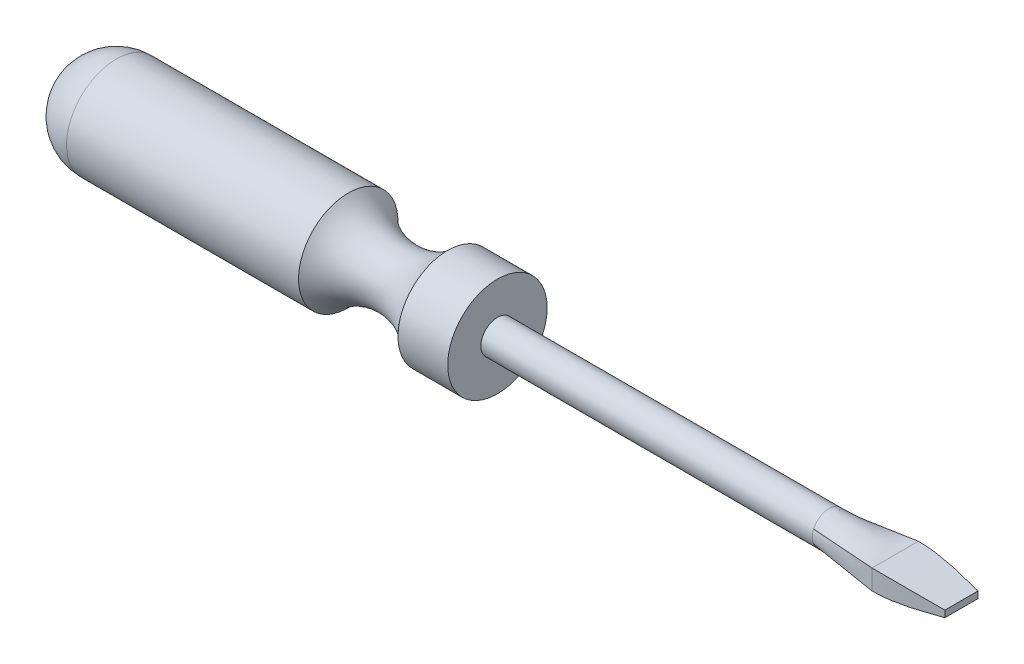
ISO-10303-21;
HEADER;
FILE_DESCRIPTION(('STEP AP214'),'2;1');
FILE_NAME('part.step','',(''),(''),'','','');
FILE_SCHEMA(('AUTOMOTIVE_DESIGN { 1 0 10303 214 1 1 1 1 }'));
ENDSEC;
DATA;
#1=APPLICATION_CONTEXT('core data for automotive mechanical design processes');
#2=APPLICATION_PROTOCOL_DEFINITION('international standard','automotive_design',2000,#1);
#3=PRODUCT_CONTEXT('',#1,'mechanical');
#4=PRODUCT('Part','Part','',(#3));
#5=PRODUCT_RELATED_PRODUCT_CATEGORY('part','',(#4));
#6=PRODUCT_DEFINITION_FORMATION('','',#4);
#7=PRODUCT_DEFINITION_CONTEXT('part definition',#1,'design');
#8=PRODUCT_DEFINITION('design','',#6,#7);
#9=PRODUCT_DEFINITION_SHAPE('','',#8);
#10=(LENGTH_UNIT() NAMED_UNIT(*) SI_UNIT(.MILLI.,.METRE.));
#11=(NAMED_UNIT(*) PLANE_ANGLE_UNIT() SI_UNIT($,.RADIAN.));
#12=(NAMED_UNIT(*) SI_UNIT($,.STERADIAN.) SOLID_ANGLE_UNIT());
#13=UNCERTAINTY_MEASURE_WITH_UNIT(LENGTH_MEASURE(1.E-05),#10,'distance_accuracy_value','');
#14=(GEOMETRIC_REPRESENTATION_CONTEXT(3) GLOBAL_UNCERTAINTY_ASSIGNED_CONTEXT((#13)) GLOBAL_UNIT_ASSIGNED_CONTEXT((#10,
#11,#12)) REPRESENTATION_CONTEXT('',''));
#15=CARTESIAN_POINT('',(0.,0.,0.));
#16=DIRECTION('',(0.,0.,1.));
#17=DIRECTION('',(1.,0.,0.));
#18=AXIS2_PLACEMENT_3D('',#15,#16,#17);
#19=CARTESIAN_POINT('',(-38.1,0.,0.));
#20=DIRECTION('',(1.,0.,0.));
#21=DIRECTION('',(0.,0.,-1.));
#22=AXIS2_PLACEMENT_3D('',#19,#20,#21);
#23=TOROIDAL_SURFACE('',#22,35.8505208252602,25.4);
#24=CARTESIAN_POINT('',(-19.05,0.,0.));
#25=DIRECTION('',(1.,0.,0.));
#26=DIRECTION('',(0.,0.,-1.));
#27=AXIS2_PLACEMENT_3D('',#24,#25,#26);
#28=CIRCLE('',#27,19.05);
#29=CARTESIAN_POINT('',(-19.05,0.,-19.05));
#30=VERTEX_POINT('',#29);
#31=EDGE_CURVE('E303',#30,#30,#28,.T.);
#32=ORIENTED_EDGE('',*,*,#31,.F.);
#33=EDGE_LOOP('',(#32));
#34=FACE_BOUND('',#33,.T.);
#35=CARTESIAN_POINT('',(-57.15,0.,0.));
#36=DIRECTION('',(1.,0.,0.));
#37=DIRECTION('',(0.,0.,-1.));
#38=AXIS2_PLACEMENT_3D('',#35,#36,#37);
#39=CIRCLE('',#38,19.05);
#40=CARTESIAN_POINT('',(-57.15,0.,-19.05));
#41=VERTEX_POINT('',#40);
#42=EDGE_CURVE('E114',#41,#41,#39,.T.);
#43=ORIENTED_EDGE('',*,*,#42,.T.);
#44=EDGE_LOOP('',(#43));
#45=FACE_BOUND('',#44,.T.);
#46=ADVANCED_FACE('F105',(#34,#45),#23,.F.);
#47=CARTESIAN_POINT('',(0.,0.,0.));
#48=DIRECTION('',(1.,0.,0.));
#49=DIRECTION('',(0.,0.,-1.));
#50=AXIS2_PLACEMENT_3D('',#47,#48,#49);
#51=CYLINDRICAL_SURFACE('',#50,19.05);
#52=ORIENTED_EDGE('',*,*,#42,.F.);
#53=EDGE_LOOP('',(#52));
#54=FACE_BOUND('',#53,.T.);
#55=CARTESIAN_POINT('',(-146.05,0.,0.));
#56=DIRECTION('',(1.,0.,0.));
#57=DIRECTION('',(0.,0.,-1.));
#58=AXIS2_PLACEMENT_3D('',#55,#56,#57);
#59=CIRCLE('',#58,19.05);
#60=CARTESIAN_POINT('',(-146.05,0.,-19.05));
#61=VERTEX_POINT('',#60);
#62=EDGE_CURVE('E299',#61,#61,#59,.T.);
#63=ORIENTED_EDGE('',*,*,#62,.T.);
#64=EDGE_LOOP('',(#63));
#65=FACE_BOUND('',#64,.T.);
#66=ADVANCED_FACE('F286',(#54,#65),#51,.T.);
#67=CARTESIAN_POINT('',(-146.05,0.,0.));
#68=DIRECTION('',(1.,0.,0.));
#69=DIRECTION('',(0.,-1.,0.));
#70=AXIS2_PLACEMENT_3D('',#67,#68,#69);
#71=SPHERICAL_SURFACE('',#70,19.05);
#72=ORIENTED_EDGE('',*,*,#62,.F.);
#73=EDGE_LOOP('',(#72));
#74=FACE_BOUND('',#73,.T.);
#75=ADVANCED_FACE('F283',(#74),#71,.T.);
#76=CARTESIAN_POINT('',(0.,0.,0.));
#77=DIRECTION('',(-1.,0.,0.));
#78=DIRECTION('',(0.,0.,1.));
#79=AXIS2_PLACEMENT_3D('',#76,#77,#78);
#80=PLANE('',#79);
#81=CARTESIAN_POINT('',(0.,0.,0.));
#82=DIRECTION('',(1.,0.,0.));
#83=DIRECTION('',(0.,0.,-1.));
#84=AXIS2_PLACEMENT_3D('',#81,#82,#83);
#85=CIRCLE('',#84,6.35);
#86=CARTESIAN_POINT('',(0.,0.,-6.35));
#87=VERTEX_POINT('',#86);
#88=EDGE_CURVE('E12',#87,#87,#85,.T.);
#89=ORIENTED_EDGE('',*,*,#88,.F.);
#90=EDGE_LOOP('',(#89));
#91=FACE_BOUND('',#90,.T.);
#92=CARTESIAN_POINT('',(0.,0.,0.));
#93=DIRECTION('',(1.,0.,0.));
#94=DIRECTION('',(0.,0.,-1.));
#95=AXIS2_PLACEMENT_3D('',#92,#93,#94);
#96=CIRCLE('',#95,19.05);
#97=CARTESIAN_POINT('',(0.,0.,-19.05));
#98=VERTEX_POINT('',#97);
#99=EDGE_CURVE('E300',#98,#98,#96,.T.);
#100=ORIENTED_EDGE('',*,*,#99,.T.);
#101=EDGE_LOOP('',(#100));
#102=FACE_BOUND('',#101,.T.);
#103=ADVANCED_FACE('F279',(#91,#102),#80,.F.);
#104=CARTESIAN_POINT('',(0.,0.,0.));
#105=DIRECTION('',(1.,0.,0.));
#106=DIRECTION('',(0.,0.,-1.));
#107=AXIS2_PLACEMENT_3D('',#104,#105,#106);
#108=CYLINDRICAL_SURFACE('',#107,19.05);
#109=ORIENTED_EDGE('',*,*,#99,.F.);
#110=EDGE_LOOP('',(#109));
#111=FACE_BOUND('',#110,.T.);
#112=ORIENTED_EDGE('',*,*,#31,.T.);
#113=EDGE_LOOP('',(#112));
#114=FACE_BOUND('',#113,.T.);
#115=ADVANCED_FACE('F272',(#111,#114),#108,.T.);
#116=CARTESIAN_POINT('',(127.,0.,0.));
#117=DIRECTION('',(-1.,0.,0.));
#118=DIRECTION('',(0.,0.,1.));
#119=AXIS2_PLACEMENT_3D('',#116,#117,#118);
#120=CYLINDRICAL_SURFACE('',#119,6.35);
#121=CARTESIAN_POINT('',(127.,2.50138754597771,-5.83657094061467));
#122=CARTESIAN_POINT('',(127.,2.94844214367886,-5.64497611302846));
#123=CARTESIAN_POINT('',(127.,3.40865301090924,-5.38683517407006));
#124=CARTESIAN_POINT('',(127.,4.29988982111754,-4.70615087599503));
#125=CARTESIAN_POINT('',(127.,4.73049101540995,-4.28265686149858));
#126=CARTESIAN_POINT('',(127.,5.47920605203683,-3.27062625188786));
#127=CARTESIAN_POINT('',(127.,5.79593543981634,-2.68164394034329));
#128=CARTESIAN_POINT('',(127.,6.232075766083,-1.39474495557426));
#129=CARTESIAN_POINT('',(127.,6.35,-0.697860933862758));
#130=CARTESIAN_POINT('',(127.,6.35,0.697860933862757));
#131=CARTESIAN_POINT('',(127.,6.232075766083,1.39474495557426));
#132=CARTESIAN_POINT('',(127.,5.79593543981634,2.68164394034329));
#133=CARTESIAN_POINT('',(127.,5.47920605203683,3.27062625188786));
#134=CARTESIAN_POINT('',(127.,4.73049101540995,4.28265686149858));
#135=CARTESIAN_POINT('',(127.,4.29988982111754,4.70615087599503));
#136=CARTESIAN_POINT('',(127.,3.40865301090924,5.38683517407006));
#137=CARTESIAN_POINT('',(127.,2.94844214367886,5.64497611302846));
#138=CARTESIAN_POINT('',(127.,2.50138754597771,5.83657094061467));
#139=B_SPLINE_CURVE_WITH_KNOTS('',3,(#121,#122,#123,#124,#125,#126,#127,#128,#129,#130,#131,
#132,#133,#134,#135,#136,#137,#138),.UNSPECIFIED.,.F.,.F.,(4,2,2,2,2,2,2,2,4),(0.,0.125,0.25,
0.375,0.5,0.625,0.75,0.875,1.),.UNSPECIFIED.);
#140=CARTESIAN_POINT('',(127.,2.50139250402741,-5.83658255969297));
#141=VERTEX_POINT('',#140);
#142=CARTESIAN_POINT('',(127.,2.50138922971672,5.83657488013594));
#143=VERTEX_POINT('',#142);
#144=EDGE_CURVE('E307',#141,#143,#139,.T.);
#145=ORIENTED_EDGE('',*,*,#144,.F.);
#146=CARTESIAN_POINT('',(127.,0.,0.));
#147=DIRECTION('',(1.,0.,0.));
#148=DIRECTION('',(0.,0.,-1.));
#149=AXIS2_PLACEMENT_3D('',#146,#147,#148);
#150=CIRCLE('',#149,6.35);
#151=CARTESIAN_POINT('',(127.,-2.50138922971672,-5.83657488013592));
#152=VERTEX_POINT('',#151);
#153=EDGE_CURVE('E122',#152,#141,#150,.T.);
#154=ORIENTED_EDGE('',*,*,#153,.F.);
#155=CARTESIAN_POINT('',(127.,-2.50139250402742,5.83658255969299));
#156=VERTEX_POINT('',#155);
#157=EDGE_CURVE('E128',#156,#152,#150,.T.);
#158=ORIENTED_EDGE('',*,*,#157,.F.);
#159=EDGE_CURVE('E173',#143,#156,#150,.T.);
#160=ORIENTED_EDGE('',*,*,#159,.F.);
#161=EDGE_LOOP('',(#145,#154,#158,#160));
#162=FACE_BOUND('',#161,.T.);
#163=ORIENTED_EDGE('',*,*,#88,.T.);
#164=EDGE_LOOP('',(#163));
#165=FACE_BOUND('',#164,.T.);
#166=ADVANCED_FACE('F261',(#162,#165),#120,.T.);
#167=CARTESIAN_POINT('',(127.,2.50138754597771,-5.83657094061467));
#168=CARTESIAN_POINT('',(152.4,3.81,-8.89));
#169=CARTESIAN_POINT('',(127.,2.94844214367886,-5.64497611302846));
#170=CARTESIAN_POINT('',(152.4,3.81,-8.14916666666666));
#171=CARTESIAN_POINT('',(127.,3.40865301090924,-5.38683517407006));
#172=CARTESIAN_POINT('',(152.4,3.81,-7.40833333333333));
#173=CARTESIAN_POINT('',(127.,4.29988982111754,-4.70615087599503));
#174=CARTESIAN_POINT('',(152.4,3.81,-5.92666666666666));
#175=CARTESIAN_POINT('',(127.,4.73049101540995,-4.28265686149858));
#176=CARTESIAN_POINT('',(152.4,3.81,-5.18583333333333));
#177=CARTESIAN_POINT('',(127.,5.47920605203683,-3.27062625188786));
#178=CARTESIAN_POINT('',(152.4,3.81,-3.70416666666667));
#179=CARTESIAN_POINT('',(127.,5.79593543981634,-2.68164394034329));
#180=CARTESIAN_POINT('',(152.4,3.81,-2.96333333333333));
#181=CARTESIAN_POINT('',(127.,6.232075766083,-1.39474495557426));
#182=CARTESIAN_POINT('',(152.4,3.81,-1.48166666666667));
#183=CARTESIAN_POINT('',(127.,6.35,-0.697860933862758));
#184=CARTESIAN_POINT('',(152.4,3.81,-0.740833333333334));
#185=CARTESIAN_POINT('',(127.,6.35,0.697860933862757));
#186=CARTESIAN_POINT('',(152.4,3.81,0.740833333333333));
#187=CARTESIAN_POINT('',(127.,6.232075766083,1.39474495557426));
#188=CARTESIAN_POINT('',(152.4,3.81,1.48166666666667));
#189=CARTESIAN_POINT('',(127.,5.79593543981634,2.68164394034329));
#190=CARTESIAN_POINT('',(152.4,3.81,2.96333333333333));
#191=CARTESIAN_POINT('',(127.,5.47920605203683,3.27062625188786));
#192=CARTESIAN_POINT('',(152.4,3.81,3.70416666666667));
#193=CARTESIAN_POINT('',(127.,4.73049101540995,4.28265686149858));
#194=CARTESIAN_POINT('',(152.4,3.81,5.18583333333333));
#195=CARTESIAN_POINT('',(127.,4.29988982111754,4.70615087599503));
#196=CARTESIAN_POINT('',(152.4,3.81,5.92666666666667));
#197=CARTESIAN_POINT('',(127.,3.40865301090924,5.38683517407006));
#198=CARTESIAN_POINT('',(152.4,3.81,7.40833333333333));
#199=CARTESIAN_POINT('',(127.,2.94844214367886,5.64497611302846));
#200=CARTESIAN_POINT('',(152.4,3.81,8.14916666666667));
#201=CARTESIAN_POINT('',(127.,2.50138754597771,5.83657094061467));
#202=CARTESIAN_POINT('',(152.4,3.81,8.89));
#203=B_SPLINE_SURFACE_WITH_KNOTS('',3,1,((#167,#168),(#169,#170),(#171,#172),(#173,#174),(#175,
#176),(#177,#178),(#179,#180),(#181,#182),(#183,#184),(#185,#186),(#187,#188),(#189,#190),(#191,
#192),(#193,#194),(#195,#196),(#197,#198),(#199,#200),(#201,#202)),.UNSPECIFIED.,.F.,.F.,.F.,(4,
2,2,2,2,2,2,2,4),(2,2),(0.,0.125,0.25,0.375,0.5,0.625,0.75,0.875,1.),(0.,1.),.UNSPECIFIED.);
#204=DIRECTION('',(0.991555349267936,0.0510851054686787,0.119198579426917));
#205=VECTOR('',#204,1.);
#206=CARTESIAN_POINT('',(139.7,3.15569377298886,7.36328547030733));
#207=LINE('',#206,#205);
#208=CARTESIAN_POINT('',(152.4,3.81,8.89));
#209=VERTEX_POINT('',#208);
#210=EDGE_CURVE('E409',#143,#209,#207,.T.);
#211=DIRECTION('',(0.,0.,1.));
#212=VECTOR('',#211,1.);
#213=CARTESIAN_POINT('',(152.4,3.81,8.89));
#214=LINE('',#213,#212);
#215=CARTESIAN_POINT('',(152.4,3.81,-8.89));
#216=VERTEX_POINT('',#215);
#217=EDGE_CURVE('E315',#216,#209,#214,.T.);
#218=DIRECTION('',(-0.991555349267936,-0.0510851054686787,0.119198579426917));
#219=VECTOR('',#218,1.);
#220=CARTESIAN_POINT('',(139.7,3.15569377298886,-7.36328547030733));
#221=LINE('',#220,#219);
#222=EDGE_CURVE('E410',#216,#141,#221,.T.);
#223=ORIENTED_EDGE('',*,*,#144,.T.);
#224=ORIENTED_EDGE('',*,*,#210,.T.);
#225=ORIENTED_EDGE('',*,*,#217,.F.);
#226=ORIENTED_EDGE('',*,*,#222,.T.);
#227=EDGE_LOOP('',(#223,#224,#225,#226));
#228=FACE_BOUND('',#227,.T.);
#229=ADVANCED_FACE('F271',(#228),#203,.T.);
#230=CARTESIAN_POINT('',(127.,2.50138754597772,5.83657094061467));
#231=CARTESIAN_POINT('',(152.4,3.81,8.89));
#232=CARTESIAN_POINT('',(127.,2.1181978908053,6.0007950785457));
#233=CARTESIAN_POINT('',(152.4,3.175,8.89));
#234=CARTESIAN_POINT('',(127.,1.710772808108,6.1303017425397));
#235=CARTESIAN_POINT('',(152.4,2.54,8.89));
#236=CARTESIAN_POINT('',(127.,0.868829874417571,6.30495659817469));
#237=CARTESIAN_POINT('',(152.4,1.27,8.89));
#238=CARTESIAN_POINT('',(127.,0.434462135803981,6.35));
#239=CARTESIAN_POINT('',(152.4,0.634999999999999,8.89));
#240=CARTESIAN_POINT('',(127.,-0.434462135803979,6.35));
#241=CARTESIAN_POINT('',(152.4,-0.635000000000001,8.89));
#242=CARTESIAN_POINT('',(127.,-0.868829874417569,6.30495659817469));
#243=CARTESIAN_POINT('',(152.4,-1.27,8.89));
#244=CARTESIAN_POINT('',(127.,-1.710772808108,6.1303017425397));
#245=CARTESIAN_POINT('',(152.4,-2.54,8.89));
#246=CARTESIAN_POINT('',(127.,-2.1181978908053,6.0007950785457));
#247=CARTESIAN_POINT('',(152.4,-3.175,8.89));
#248=CARTESIAN_POINT('',(127.,-2.50138754597771,5.83657094061467));
#249=CARTESIAN_POINT('',(152.4,-3.81,8.89));
#250=B_SPLINE_SURFACE_WITH_KNOTS('',3,1,((#230,#231),(#232,#233),(#234,#235),(#236,#237),(#238,
#239),(#240,#241),(#242,#243),(#244,#245),(#246,#247),(#248,#249)),.UNSPECIFIED.,.F.,.F.,.F.,(4,
2,2,2,4),(2,2),(0.,0.25,0.5,0.75,1.),(0.,1.),.UNSPECIFIED.);
#251=DIRECTION('',(0.991555349267936,-0.0510851054686787,0.119198579426917));
#252=VECTOR('',#251,1.);
#253=CARTESIAN_POINT('',(139.7,-3.15569377298886,7.36328547030733));
#254=LINE('',#253,#252);
#255=CARTESIAN_POINT('',(152.4,-3.81,8.89));
#256=VERTEX_POINT('',#255);
#257=EDGE_CURVE('E411',#156,#256,#254,.T.);
#258=DIRECTION('',(0.,-1.,0.));
#259=VECTOR('',#258,1.);
#260=CARTESIAN_POINT('',(152.4,3.81,8.89));
#261=LINE('',#260,#259);
#262=EDGE_CURVE('E169',#209,#256,#261,.T.);
#263=ORIENTED_EDGE('',*,*,#159,.T.);
#264=ORIENTED_EDGE('',*,*,#257,.T.);
#265=ORIENTED_EDGE('',*,*,#262,.F.);
#266=ORIENTED_EDGE('',*,*,#210,.F.);
#267=EDGE_LOOP('',(#263,#264,#265,#266));
#268=FACE_BOUND('',#267,.T.);
#269=ADVANCED_FACE('F326',(#268),#250,.T.);
#270=CARTESIAN_POINT('',(127.,-2.50138754597772,-5.83657094061467));
#271=CARTESIAN_POINT('',(152.4,-3.81,-8.89));
#272=CARTESIAN_POINT('',(127.,-2.1181978908053,-6.0007950785457));
#273=CARTESIAN_POINT('',(152.4,-3.175,-8.89));
#274=CARTESIAN_POINT('',(127.,-1.710772808108,-6.1303017425397));
#275=CARTESIAN_POINT('',(152.4,-2.53999999999999,-8.89));
#276=CARTESIAN_POINT('',(127.,-0.868829874417571,-6.30495659817469));
#277=CARTESIAN_POINT('',(152.4,-1.26999999999999,-8.89));
#278=CARTESIAN_POINT('',(127.,-0.434462135803981,-6.35));
#279=CARTESIAN_POINT('',(152.4,-0.634999999999991,-8.89));
#280=CARTESIAN_POINT('',(127.,0.434462135803979,-6.35));
#281=CARTESIAN_POINT('',(152.4,0.635000000000008,-8.89));
#282=CARTESIAN_POINT('',(127.,0.86882987441757,-6.30495659817469));
#283=CARTESIAN_POINT('',(152.4,1.27000000000001,-8.89));
#284=CARTESIAN_POINT('',(127.,1.710772808108,-6.1303017425397));
#285=CARTESIAN_POINT('',(152.4,2.54,-8.89));
#286=CARTESIAN_POINT('',(127.,2.1181978908053,-6.0007950785457));
#287=CARTESIAN_POINT('',(152.4,3.175,-8.89));
#288=CARTESIAN_POINT('',(127.,2.50138754597771,-5.83657094061467));
#289=CARTESIAN_POINT('',(152.4,3.81,-8.89));
#290=B_SPLINE_SURFACE_WITH_KNOTS('',3,1,((#270,#271),(#272,#273),(#274,#275),(#276,#277),(#278,
#279),(#280,#281),(#282,#283),(#284,#285),(#286,#287),(#288,#289)),.UNSPECIFIED.,.F.,.F.,.F.,(4,
2,2,2,4),(2,2),(0.,0.25,0.5,0.75,1.),(0.,1.),.UNSPECIFIED.);
#291=DIRECTION('',(0.,1.,0.));
#292=VECTOR('',#291,1.);
#293=CARTESIAN_POINT('',(152.4,3.81,-8.89));
#294=LINE('',#293,#292);
#295=CARTESIAN_POINT('',(152.4,-3.81,-8.89));
#296=VERTEX_POINT('',#295);
#297=EDGE_CURVE('E108',#296,#216,#294,.T.);
#298=DIRECTION('',(0.991555349267936,-0.0510851054686787,-0.119198579426917));
#299=VECTOR('',#298,1.);
#300=CARTESIAN_POINT('',(139.7,-3.15569377298886,-7.36328547030733));
#301=LINE('',#300,#299);
#302=EDGE_CURVE('E413',#152,#296,#301,.T.);
#303=ORIENTED_EDGE('',*,*,#153,.T.);
#304=ORIENTED_EDGE('',*,*,#222,.F.);
#305=ORIENTED_EDGE('',*,*,#297,.F.);
#306=ORIENTED_EDGE('',*,*,#302,.F.);
#307=EDGE_LOOP('',(#303,#304,#305,#306));
#308=FACE_BOUND('',#307,.T.);
#309=ADVANCED_FACE('F337',(#308),#290,.T.);
#310=CARTESIAN_POINT('',(127.,-2.50138754597771,5.83657094061467));
#311=CARTESIAN_POINT('',(152.4,-3.81,8.89));
#312=CARTESIAN_POINT('',(127.,-2.94844214367886,5.64497611302846));
#313=CARTESIAN_POINT('',(152.4,-3.81,8.14916666666667));
#314=CARTESIAN_POINT('',(127.,-3.40865301090924,5.38683517407006));
#315=CARTESIAN_POINT('',(152.4,-3.81,7.40833333333333));
#316=CARTESIAN_POINT('',(127.,-4.29988982111754,4.70615087599503));
#317=CARTESIAN_POINT('',(152.4,-3.81,5.92666666666666));
#318=CARTESIAN_POINT('',(127.,-4.73049101540995,4.28265686149858));
#319=CARTESIAN_POINT('',(152.4,-3.81,5.18583333333333));
#320=CARTESIAN_POINT('',(127.,-5.47920605203683,3.27062625188786));
#321=CARTESIAN_POINT('',(152.4,-3.81,3.70416666666666));
#322=CARTESIAN_POINT('',(127.,-5.79593543981634,2.68164394034329));
#323=CARTESIAN_POINT('',(152.4,-3.81,2.96333333333333));
#324=CARTESIAN_POINT('',(127.,-6.232075766083,1.39474495557426));
#325=CARTESIAN_POINT('',(152.4,-3.81,1.48166666666666));
#326=CARTESIAN_POINT('',(127.,-6.35,0.697860933862759));
#327=CARTESIAN_POINT('',(152.4,-3.81,0.740833333333331));
#328=CARTESIAN_POINT('',(127.,-6.35,-0.697860933862756));
#329=CARTESIAN_POINT('',(152.4,-3.81,-0.740833333333336));
#330=CARTESIAN_POINT('',(127.,-6.232075766083,-1.39474495557426));
#331=CARTESIAN_POINT('',(152.4,-3.81,-1.48166666666667));
#332=CARTESIAN_POINT('',(127.,-5.79593543981634,-2.68164394034329));
#333=CARTESIAN_POINT('',(152.4,-3.81,-2.96333333333333));
#334=CARTESIAN_POINT('',(127.,-5.47920605203683,-3.27062625188786));
#335=CARTESIAN_POINT('',(152.4,-3.81,-3.70416666666667));
#336=CARTESIAN_POINT('',(127.,-4.73049101540994,-4.28265686149858));
#337=CARTESIAN_POINT('',(152.4,-3.81,-5.18583333333333));
#338=CARTESIAN_POINT('',(127.,-4.29988982111754,-4.70615087599503));
#339=CARTESIAN_POINT('',(152.4,-3.81,-5.92666666666667));
#340=CARTESIAN_POINT('',(127.,-3.40865301090924,-5.38683517407006));
#341=CARTESIAN_POINT('',(152.4,-3.81,-7.40833333333333));
#342=CARTESIAN_POINT('',(127.,-2.94844214367887,-5.64497611302846));
#343=CARTESIAN_POINT('',(152.4,-3.81,-8.14916666666667));
#344=CARTESIAN_POINT('',(127.,-2.50138754597771,-5.83657094061467));
#345=CARTESIAN_POINT('',(152.4,-3.81,-8.89));
#346=B_SPLINE_SURFACE_WITH_KNOTS('',3,1,((#310,#311),(#312,#313),(#314,#315),(#316,#317),(#318,
#319),(#320,#321),(#322,#323),(#324,#325),(#326,#327),(#328,#329),(#330,#331),(#332,#333),(#334,
#335),(#336,#337),(#338,#339),(#340,#341),(#342,#343),(#344,#345)),.UNSPECIFIED.,.F.,.F.,.F.,(4,
2,2,2,2,2,2,2,4),(2,2),(0.,0.125,0.25,0.375,0.5,0.625,0.75,0.875,1.),(0.,1.),.UNSPECIFIED.);
#347=DIRECTION('',(0.,0.,-1.));
#348=VECTOR('',#347,1.);
#349=CARTESIAN_POINT('',(152.4,-3.81,8.89));
#350=LINE('',#349,#348);
#351=EDGE_CURVE('E313',#256,#296,#350,.T.);
#352=ORIENTED_EDGE('',*,*,#157,.T.);
#353=ORIENTED_EDGE('',*,*,#302,.T.);
#354=ORIENTED_EDGE('',*,*,#351,.F.);
#355=ORIENTED_EDGE('',*,*,#257,.F.);
#356=EDGE_LOOP('',(#352,#353,#354,#355));
#357=FACE_BOUND('',#356,.T.);
#358=ADVANCED_FACE('F211',(#357),#346,.T.);
#359=CARTESIAN_POINT('',(177.8,0.,0.));
#360=DIRECTION('',(-1.,0.,0.));
#361=DIRECTION('',(0.,0.,1.));
#362=AXIS2_PLACEMENT_3D('',#359,#360,#361);
#363=PLANE('',#362);
#364=DIRECTION('',(0.,1.,0.));
#365=VECTOR('',#364,1.);
#366=CARTESIAN_POINT('',(177.8,-1.27,-6.35));
#367=LINE('',#366,#365);
#368=CARTESIAN_POINT('',(177.8,-1.27,-6.35));
#369=VERTEX_POINT('',#368);
#370=CARTESIAN_POINT('',(177.8,1.27,-6.35));
#371=VERTEX_POINT('',#370);
#372=EDGE_CURVE('E234',#369,#371,#367,.T.);
#373=ORIENTED_EDGE('',*,*,#372,.T.);
#374=DIRECTION('',(0.,0.,1.));
#375=VECTOR('',#374,1.);
#376=CARTESIAN_POINT('',(177.8,1.27,6.35));
#377=LINE('',#376,#375);
#378=CARTESIAN_POINT('',(177.8,1.27,6.35));
#379=VERTEX_POINT('',#378);
#380=EDGE_CURVE('E191',#371,#379,#377,.T.);
#381=ORIENTED_EDGE('',*,*,#380,.T.);
#382=DIRECTION('',(0.,-1.,0.));
#383=VECTOR('',#382,1.);
#384=CARTESIAN_POINT('',(177.8,-1.27,6.35));
#385=LINE('',#384,#383);
#386=CARTESIAN_POINT('',(177.8,-1.27,6.35));
#387=VERTEX_POINT('',#386);
#388=EDGE_CURVE('E166',#379,#387,#385,.T.);
#389=ORIENTED_EDGE('',*,*,#388,.T.);
#390=DIRECTION('',(0.,0.,-1.));
#391=VECTOR('',#390,1.);
#392=CARTESIAN_POINT('',(177.8,-1.27,6.35));
#393=LINE('',#392,#391);
#394=EDGE_CURVE('E177',#387,#369,#393,.T.);
#395=ORIENTED_EDGE('',*,*,#394,.T.);
#396=EDGE_LOOP('',(#373,#381,#389,#395));
#397=FACE_BOUND('',#396,.T.);
#398=ADVANCED_FACE('F190',(#397),#363,.F.);
#399=CARTESIAN_POINT('',(177.8,1.27,6.35));
#400=CARTESIAN_POINT('',(169.375457090573,2.54,7.62));
#401=CARTESIAN_POINT('',(160.950914181147,3.81,8.89));
#402=CARTESIAN_POINT('',(152.4,3.81,8.89));
#403=CARTESIAN_POINT('',(177.8,1.27,2.11666666666666));
#404=CARTESIAN_POINT('',(169.375457090573,2.54,2.54));
#405=CARTESIAN_POINT('',(160.950914181147,3.81,2.96333333333333));
#406=CARTESIAN_POINT('',(152.4,3.81,2.96333333333333));
#407=CARTESIAN_POINT('',(177.8,1.27,-2.11666666666667));
#408=CARTESIAN_POINT('',(169.375457090573,2.54,-2.54));
#409=CARTESIAN_POINT('',(160.950914181147,3.81,-2.96333333333333));
#410=CARTESIAN_POINT('',(152.4,3.81,-2.96333333333333));
#411=CARTESIAN_POINT('',(177.8,1.27,-6.35));
#412=CARTESIAN_POINT('',(169.375457090573,2.54,-7.62));
#413=CARTESIAN_POINT('',(160.950914181147,3.81,-8.89));
#414=CARTESIAN_POINT('',(152.4,3.81,-8.89));
#415=B_SPLINE_SURFACE_WITH_KNOTS('',3,3,((#399,#400,#401,#402),(#403,#404,#405,#406),(#407,#408,
#409,#410),(#411,#412,#413,#414)),.UNSPECIFIED.,.F.,.F.,.F.,(4,4),(4,4),(0.,1.),(0.,1.),.UNSPECIFIED.);
#416=CARTESIAN_POINT('',(177.8,1.27,-6.35));
#417=CARTESIAN_POINT('',(169.375457090573,2.54,-7.62));
#418=CARTESIAN_POINT('',(160.950914181147,3.81,-8.89));
#419=CARTESIAN_POINT('',(152.4,3.81,-8.89));
#420=B_SPLINE_CURVE_WITH_KNOTS('',3,(#416,#417,#418,#419),.UNSPECIFIED.,.F.,.F.,(4,4),(0.,1.),.UNSPECIFIED.);
#421=EDGE_CURVE('E445',#371,#216,#420,.T.);
#422=CARTESIAN_POINT('',(177.8,1.27,6.35));
#423=CARTESIAN_POINT('',(169.375457090573,2.54,7.62));
#424=CARTESIAN_POINT('',(160.950914181147,3.81,8.89));
#425=CARTESIAN_POINT('',(152.4,3.81,8.89));
#426=B_SPLINE_CURVE_WITH_KNOTS('',3,(#422,#423,#424,#425),.UNSPECIFIED.,.F.,.F.,(4,4),(0.,1.),.UNSPECIFIED.);
#427=EDGE_CURVE('E185',#209,#379,#426,.F.);
#428=ORIENTED_EDGE('',*,*,#380,.F.);
#429=ORIENTED_EDGE('',*,*,#421,.T.);
#430=ORIENTED_EDGE('',*,*,#217,.T.);
#431=ORIENTED_EDGE('',*,*,#427,.T.);
#432=EDGE_LOOP('',(#428,#429,#430,#431));
#433=FACE_BOUND('',#432,.T.);
#434=ADVANCED_FACE('F210',(#433),#415,.T.);
#435=CARTESIAN_POINT('',(177.8,1.27,-6.35));
#436=CARTESIAN_POINT('',(169.375457090573,2.54,-7.62));
#437=CARTESIAN_POINT('',(160.950914181147,3.81,-8.89));
#438=CARTESIAN_POINT('',(152.4,3.81,-8.89));
#439=CARTESIAN_POINT('',(177.8,0.423333333333333,-6.35));
#440=CARTESIAN_POINT('',(169.375457090573,0.846666666666667,-7.62));
#441=CARTESIAN_POINT('',(160.950914181147,1.27,-8.89));
#442=CARTESIAN_POINT('',(152.4,1.27,-8.89));
#443=CARTESIAN_POINT('',(177.8,-0.423333333333334,-6.35));
#444=CARTESIAN_POINT('',(169.375457090573,-0.846666666666666,-7.62));
#445=CARTESIAN_POINT('',(160.950914181147,-1.27,-8.89));
#446=CARTESIAN_POINT('',(152.4,-1.27,-8.89));
#447=CARTESIAN_POINT('',(177.8,-1.27,-6.35));
#448=CARTESIAN_POINT('',(169.375457090573,-2.54,-7.62));
#449=CARTESIAN_POINT('',(160.950914181147,-3.81,-8.89));
#450=CARTESIAN_POINT('',(152.4,-3.81,-8.89));
#451=B_SPLINE_SURFACE_WITH_KNOTS('',3,3,((#435,#436,#437,#438),(#439,#440,#441,#442),(#443,#444,
#445,#446),(#447,#448,#449,#450)),.UNSPECIFIED.,.F.,.F.,.F.,(4,4),(4,4),(0.,1.),(0.,1.),.UNSPECIFIED.);
#452=CARTESIAN_POINT('',(177.8,-1.27,-6.35));
#453=CARTESIAN_POINT('',(169.375457090573,-2.54,-7.62));
#454=CARTESIAN_POINT('',(160.950914181147,-3.81,-8.89));
#455=CARTESIAN_POINT('',(152.4,-3.81,-8.89));
#456=B_SPLINE_CURVE_WITH_KNOTS('',3,(#452,#453,#454,#455),.UNSPECIFIED.,.F.,.F.,(4,4),(0.,1.),.UNSPECIFIED.);
#457=EDGE_CURVE('E174',#369,#296,#456,.T.);
#458=ORIENTED_EDGE('',*,*,#372,.F.);
#459=ORIENTED_EDGE('',*,*,#457,.T.);
#460=ORIENTED_EDGE('',*,*,#297,.T.);
#461=ORIENTED_EDGE('',*,*,#421,.F.);
#462=EDGE_LOOP('',(#458,#459,#460,#461));
#463=FACE_BOUND('',#462,.T.);
#464=ADVANCED_FACE('F444',(#463),#451,.T.);
#465=CARTESIAN_POINT('',(177.8,-1.27,6.35));
#466=CARTESIAN_POINT('',(169.375457090573,-2.54,7.62));
#467=CARTESIAN_POINT('',(160.950914181147,-3.81,8.89));
#468=CARTESIAN_POINT('',(152.4,-3.81,8.89));
#469=CARTESIAN_POINT('',(177.8,-0.423333333333334,6.35));
#470=CARTESIAN_POINT('',(169.375457090573,-0.846666666666667,7.62));
#471=CARTESIAN_POINT('',(160.950914181147,-1.27,8.89));
#472=CARTESIAN_POINT('',(152.4,-1.27,8.89));
#473=CARTESIAN_POINT('',(177.8,0.423333333333333,6.35));
#474=CARTESIAN_POINT('',(169.375457090573,0.846666666666666,7.62));
#475=CARTESIAN_POINT('',(160.950914181147,1.27,8.89));
#476=CARTESIAN_POINT('',(152.4,1.27,8.89));
#477=CARTESIAN_POINT('',(177.8,1.27,6.35));
#478=CARTESIAN_POINT('',(169.375457090573,2.54,7.62));
#479=CARTESIAN_POINT('',(160.950914181147,3.81,8.89));
#480=CARTESIAN_POINT('',(152.4,3.81,8.89));
#481=B_SPLINE_SURFACE_WITH_KNOTS('',3,3,((#465,#466,#467,#468),(#469,#470,#471,#472),(#473,#474,
#475,#476),(#477,#478,#479,#480)),.UNSPECIFIED.,.F.,.F.,.F.,(4,4),(4,4),(0.,1.),(0.,1.),.UNSPECIFIED.);
#482=CARTESIAN_POINT('',(177.8,-1.27,6.35));
#483=CARTESIAN_POINT('',(169.375457090573,-2.54,7.62));
#484=CARTESIAN_POINT('',(160.950914181147,-3.81,8.89));
#485=CARTESIAN_POINT('',(152.4,-3.81,8.89));
#486=B_SPLINE_CURVE_WITH_KNOTS('',3,(#482,#483,#484,#485),.UNSPECIFIED.,.F.,.F.,(4,4),(0.,1.),.UNSPECIFIED.);
#487=EDGE_CURVE('E161',#387,#256,#486,.T.);
#488=ORIENTED_EDGE('',*,*,#388,.F.);
#489=ORIENTED_EDGE('',*,*,#427,.F.);
#490=ORIENTED_EDGE('',*,*,#262,.T.);
#491=ORIENTED_EDGE('',*,*,#487,.F.);
#492=EDGE_LOOP('',(#488,#489,#490,#491));
#493=FACE_BOUND('',#492,.T.);
#494=ADVANCED_FACE('F163',(#493),#481,.T.);
#495=CARTESIAN_POINT('',(177.8,-1.27,-6.35));
#496=CARTESIAN_POINT('',(169.375457090573,-2.54,-7.62));
#497=CARTESIAN_POINT('',(160.950914181147,-3.81,-8.89));
#498=CARTESIAN_POINT('',(152.4,-3.81,-8.89));
#499=CARTESIAN_POINT('',(177.8,-1.27,-2.11666666666667));
#500=CARTESIAN_POINT('',(169.375457090573,-2.54,-2.54));
#501=CARTESIAN_POINT('',(160.950914181147,-3.81,-2.96333333333333));
#502=CARTESIAN_POINT('',(152.4,-3.81,-2.96333333333333));
#503=CARTESIAN_POINT('',(177.8,-1.27,2.11666666666666));
#504=CARTESIAN_POINT('',(169.375457090573,-2.54,2.54));
#505=CARTESIAN_POINT('',(160.950914181147,-3.81,2.96333333333333));
#506=CARTESIAN_POINT('',(152.4,-3.81,2.96333333333333));
#507=CARTESIAN_POINT('',(177.8,-1.27,6.35));
#508=CARTESIAN_POINT('',(169.375457090573,-2.54,7.62));
#509=CARTESIAN_POINT('',(160.950914181147,-3.81,8.89));
#510=CARTESIAN_POINT('',(152.4,-3.81,8.89));
#511=B_SPLINE_SURFACE_WITH_KNOTS('',3,3,((#495,#496,#497,#498),(#499,#500,#501,#502),(#503,#504,
#505,#506),(#507,#508,#509,#510)),.UNSPECIFIED.,.F.,.F.,.F.,(4,4),(4,4),(0.,1.),(0.,1.),.UNSPECIFIED.);
#512=ORIENTED_EDGE('',*,*,#394,.F.);
#513=ORIENTED_EDGE('',*,*,#487,.T.);
#514=ORIENTED_EDGE('',*,*,#351,.T.);
#515=ORIENTED_EDGE('',*,*,#457,.F.);
#516=EDGE_LOOP('',(#512,#513,#514,#515));
#517=FACE_BOUND('',#516,.T.);
#518=ADVANCED_FACE('F179',(#517),#511,.T.);
#519=CLOSED_SHELL('',(#46,#66,#75,#103,#115,#166,#229,#269,#309,#358,#398,#434,#464,#494,#518));
#520=MANIFOLD_SOLID_BREP('B2',#519);
#521=ADVANCED_BREP_SHAPE_REPRESENTATION('',(#18,#520),#14);
#522=SHAPE_DEFINITION_REPRESENTATION(#9,#521);
ENDSEC;
END-ISO-10303-21;
